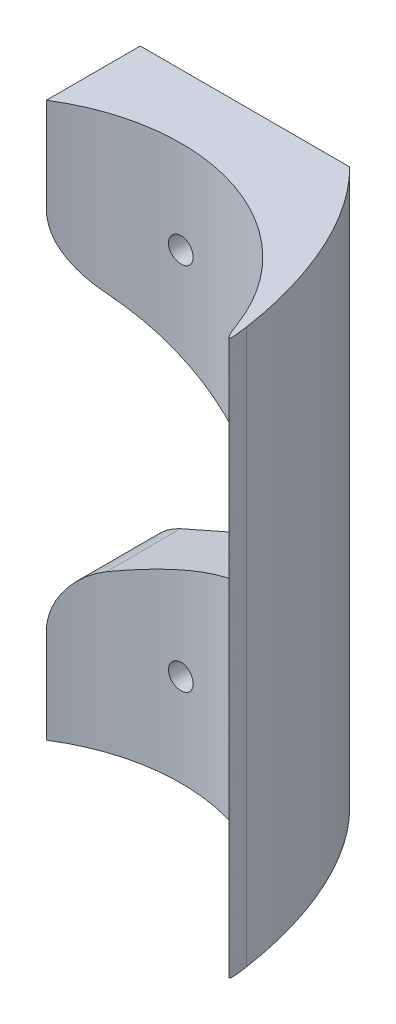
ISO-10303-21;
HEADER;
FILE_DESCRIPTION(('STEP AP214'),'2;1');
FILE_NAME('part.step','',(''),(''),'','','');
FILE_SCHEMA(('AUTOMOTIVE_DESIGN { 1 0 10303 214 1 1 1 1 }'));
ENDSEC;
DATA;
#1=APPLICATION_CONTEXT('core data for automotive mechanical design processes');
#2=APPLICATION_PROTOCOL_DEFINITION('international standard','automotive_design',2000,#1);
#3=PRODUCT_CONTEXT('',#1,'mechanical');
#4=PRODUCT('Part','Part','',(#3));
#5=PRODUCT_RELATED_PRODUCT_CATEGORY('part','',(#4));
#6=PRODUCT_DEFINITION_FORMATION('','',#4);
#7=PRODUCT_DEFINITION_CONTEXT('part definition',#1,'design');
#8=PRODUCT_DEFINITION('design','',#6,#7);
#9=PRODUCT_DEFINITION_SHAPE('','',#8);
#10=(LENGTH_UNIT() NAMED_UNIT(*) SI_UNIT(.MILLI.,.METRE.));
#11=(NAMED_UNIT(*) PLANE_ANGLE_UNIT() SI_UNIT($,.RADIAN.));
#12=(NAMED_UNIT(*) SI_UNIT($,.STERADIAN.) SOLID_ANGLE_UNIT());
#13=UNCERTAINTY_MEASURE_WITH_UNIT(LENGTH_MEASURE(1.E-05),#10,'distance_accuracy_value','');
#14=(GEOMETRIC_REPRESENTATION_CONTEXT(3) GLOBAL_UNCERTAINTY_ASSIGNED_CONTEXT((#13)) GLOBAL_UNIT_ASSIGNED_CONTEXT((#10,
#11,#12)) REPRESENTATION_CONTEXT('',''));
#15=CARTESIAN_POINT('',(0.,0.,0.));
#16=DIRECTION('',(0.,0.,1.));
#17=DIRECTION('',(1.,0.,0.));
#18=AXIS2_PLACEMENT_3D('',#15,#16,#17);
#19=CARTESIAN_POINT('',(0.,45.,-21.1803776745718));
#20=DIRECTION('',(0.,0.,-1.));
#21=DIRECTION('',(-1.,0.,0.));
#22=AXIS2_PLACEMENT_3D('',#19,#20,#21);
#23=PLANE('',#22);
#24=CARTESIAN_POINT('',(0.,7.5,-21.1803776745718));
#25=DIRECTION('',(0.,0.,-1.));
#26=DIRECTION('',(-1.,0.,0.));
#27=AXIS2_PLACEMENT_3D('',#24,#25,#26);
#28=CIRCLE('',#27,1.);
#29=CARTESIAN_POINT('',(-0.999999999999986,7.5,-21.1803776745718));
#30=VERTEX_POINT('',#29);
#31=EDGE_CURVE('E595',#30,#30,#28,.T.);
#32=ORIENTED_EDGE('',*,*,#31,.F.);
#33=EDGE_LOOP('',(#32));
#34=FACE_BOUND('',#33,.T.);
#35=DIRECTION('',(0.,1.,0.));
#36=VECTOR('',#35,1.);
#37=CARTESIAN_POINT('',(-8.5,0.,-21.1803776745718));
#38=LINE('',#37,#36);
#39=CARTESIAN_POINT('',(-8.5,0.,-21.1803776745718));
#40=VERTEX_POINT('',#39);
#41=CARTESIAN_POINT('',(-8.5,7.66500159009755,-21.1803776745718));
#42=VERTEX_POINT('',#41);
#43=EDGE_CURVE('E238',#40,#42,#38,.T.);
#44=ORIENTED_EDGE('',*,*,#43,.T.);
#45=CARTESIAN_POINT('',(-3.,7.66500159009757,-21.1803776745718));
#46=DIRECTION('',(0.,0.,-1.));
#47=DIRECTION('',(-1.,0.,0.));
#48=AXIS2_PLACEMENT_3D('',#45,#46,#47);
#49=CIRCLE('',#48,5.5);
#50=CARTESIAN_POINT('',(-5.22002113616959,12.6970494987487,-21.1803776745718));
#51=VERTEX_POINT('',#50);
#52=EDGE_CURVE('E423',#42,#51,#49,.T.);
#53=ORIENTED_EDGE('',*,*,#52,.T.);
#54=DIRECTION('',(-0.914917801572932,-0.403640206576293,0.));
#55=VECTOR('',#54,1.);
#56=CARTESIAN_POINT('',(-5.5394641564084,12.5561187545257,-21.1803776745718));
#57=LINE('',#56,#55);
#58=CARTESIAN_POINT('',(5.22002113616961,17.3029505012513,-21.1803776745718));
#59=VERTEX_POINT('',#58);
#60=EDGE_CURVE('E420',#59,#51,#57,.T.);
#61=ORIENTED_EDGE('',*,*,#60,.F.);
#62=CARTESIAN_POINT('',(3.,22.3349984099024,-21.1803776745718));
#63=DIRECTION('',(0.,0.,-1.));
#64=DIRECTION('',(-1.,0.,0.));
#65=AXIS2_PLACEMENT_3D('',#62,#63,#64);
#66=CIRCLE('',#65,5.5);
#67=CARTESIAN_POINT('',(8.5,22.3349984099024,-21.1803776745718));
#68=VERTEX_POINT('',#67);
#69=EDGE_CURVE('E415',#68,#59,#66,.T.);
#70=ORIENTED_EDGE('',*,*,#69,.F.);
#71=DIRECTION('',(0.,-1.,0.));
#72=VECTOR('',#71,1.);
#73=CARTESIAN_POINT('',(8.5,45.,-21.1803776745718));
#74=LINE('',#73,#72);
#75=CARTESIAN_POINT('',(8.5,0.,-21.1803776745718));
#76=VERTEX_POINT('',#75);
#77=EDGE_CURVE('E281',#68,#76,#74,.T.);
#78=ORIENTED_EDGE('',*,*,#77,.T.);
#79=DIRECTION('',(1.,0.,0.));
#80=VECTOR('',#79,1.);
#81=CARTESIAN_POINT('',(0.,0.,-21.1803776745718));
#82=LINE('',#81,#80);
#83=EDGE_CURVE('E443',#40,#76,#82,.T.);
#84=ORIENTED_EDGE('',*,*,#83,.F.);
#85=EDGE_LOOP('',(#44,#53,#61,#70,#78,#84));
#86=FACE_BOUND('',#85,.T.);
#87=ADVANCED_FACE('F118',(#34,#86),#23,.T.);
#88=CARTESIAN_POINT('',(0.,45.,0.));
#89=DIRECTION('',(0.,-1.,0.));
#90=DIRECTION('',(0.,0.,-1.));
#91=AXIS2_PLACEMENT_3D('',#88,#89,#90);
#92=CYLINDRICAL_SURFACE('',#91,16.);
#93=CARTESIAN_POINT('',(0.,8.50000000000001,-16.));
#94=CARTESIAN_POINT('',(-0.0561116734183641,8.49999753108858,-15.9999995845718));
#95=CARTESIAN_POINT('',(-0.112262635856497,8.49526135026496,-15.9997016695472));
#96=CARTESIAN_POINT('',(-0.223014105359192,8.47643576614751,-15.9985418686177));
#97=CARTESIAN_POINT('',(-0.277612730612396,8.46233547654854,-15.9976793263185));
#98=CARTESIAN_POINT('',(-0.383639254093894,8.42518824913567,-15.995487847518));
#99=CARTESIAN_POINT('',(-0.435068808330638,8.40214603069408,-15.9941591570758));
#100=CARTESIAN_POINT('',(-0.533316707904362,8.34777667955749,-15.9911848224785));
#101=CARTESIAN_POINT('',(-0.580136105926781,8.31645144425953,-15.989539250935));
#102=CARTESIAN_POINT('',(-0.667918229342458,8.2463538479099,-15.9861133677169));
#103=CARTESIAN_POINT('',(-0.708873140240779,8.20757170863626,-15.9843328810066));
#104=CARTESIAN_POINT('',(-0.783696905169759,8.12368133250729,-15.9808393328824));
#105=CARTESIAN_POINT('',(-0.817565463097668,8.07857283143687,-15.9791262742884));
#106=CARTESIAN_POINT('',(-0.877279186236966,7.98326595884956,-15.9759594183013));
#107=CARTESIAN_POINT('',(-0.903117860756819,7.93306351306164,-15.9745058310452));
#108=CARTESIAN_POINT('',(-0.945996818003619,7.82902237763189,-15.9720241042778));
#109=CARTESIAN_POINT('',(-0.963037195352549,7.77518372710296,-15.9709959601911));
#110=CARTESIAN_POINT('',(-0.987814158715018,7.6654737360691,-15.9694827304962));
#111=CARTESIAN_POINT('',(-0.995562984542572,7.60960516982238,-15.9689969305132));
#112=CARTESIAN_POINT('',(-1.00157466797483,7.49735836087156,-15.9686210332971));
#113=CARTESIAN_POINT('',(-0.999837633013946,7.4409801239471,-15.9687309293172));
#114=CARTESIAN_POINT('',(-0.986937060851403,7.32939774759016,-15.9695333678952));
#115=CARTESIAN_POINT('',(-0.975786769220196,7.27419207006829,-15.9702250917472));
#116=CARTESIAN_POINT('',(-0.944396744262104,7.1664375029772,-15.9721119435897));
#117=CARTESIAN_POINT('',(-0.924156956473636,7.11388862932887,-15.9733070745964));
#118=CARTESIAN_POINT('',(-0.875147436127316,7.01289678972626,-15.976066999066));
#119=CARTESIAN_POINT('',(-0.846371695029927,6.96445674700762,-15.9776320527627));
#120=CARTESIAN_POINT('',(-0.781111460834642,6.87308956471971,-15.9809551904227));
#121=CARTESIAN_POINT('',(-0.744626881072897,6.83016248713669,-15.982713276556));
#122=CARTESIAN_POINT('',(-0.664910031499442,6.75096271176142,-15.9862279896743));
#123=CARTESIAN_POINT('',(-0.62166629833764,6.71470155081568,-15.9879846089879));
#124=CARTESIAN_POINT('',(-0.529698860612781,6.64995191992668,-15.991295531007));
#125=CARTESIAN_POINT('',(-0.480975154135164,6.62146345269901,-15.9928498336419));
#126=CARTESIAN_POINT('',(-0.379423861379106,6.57306886990958,-15.9955810990219));
#127=CARTESIAN_POINT('',(-0.326596066323377,6.55316319129692,-15.996758042555));
#128=CARTESIAN_POINT('',(-0.218339310710251,6.52250694226667,-15.9986017059347));
#129=CARTESIAN_POINT('',(-0.16291038053899,6.51175626492958,-15.9992684317401));
#130=CARTESIAN_POINT('',(-0.0511248774990548,6.49972948638218,-16.0000157621239));
#131=CARTESIAN_POINT('',(0.0052299729584275,6.49843743445324,-16.0000973534494));
#132=CARTESIAN_POINT('',(0.117355606048497,6.50532290663308,-15.9996678453116));
#133=CARTESIAN_POINT('',(0.17312639171902,6.51350038146265,-15.9991567489326));
#134=CARTESIAN_POINT('',(0.282455831103082,6.53907957136343,-15.9976000372996));
#135=CARTESIAN_POINT('',(0.33601620355398,6.55647396826126,-15.9965548461366));
#136=CARTESIAN_POINT('',(0.439457481288695,6.59998580594548,-15.9940475327632));
#137=CARTESIAN_POINT('',(0.489338353473688,6.62610332518877,-15.9925854068029));
#138=CARTESIAN_POINT('',(0.584077738206371,6.68636063083291,-15.9894060556935));
#139=CARTESIAN_POINT('',(0.628929463573064,6.7205110702816,-15.9876884929127));
#140=CARTESIAN_POINT('',(0.712269053211672,6.79584930414364,-15.9841926926019));
#141=CARTESIAN_POINT('',(0.750756854818272,6.83703716784613,-15.9824144544745));
#142=CARTESIAN_POINT('',(0.820330100485819,6.92534989395919,-15.9789948666346));
#143=CARTESIAN_POINT('',(0.851405196389107,6.97248291721468,-15.9773537103402));
#144=CARTESIAN_POINT('',(0.905200136492281,7.07130700937393,-15.9743964406003));
#145=CARTESIAN_POINT('',(0.927920032215697,7.12299805016758,-15.9730803251503));
#146=CARTESIAN_POINT('',(0.96434171908708,7.22943306063597,-15.9709229534197));
#147=CARTESIAN_POINT('',(0.978050023426237,7.28417479428993,-15.9700813542419));
#148=CARTESIAN_POINT('',(0.99608067084691,7.39518833644791,-15.968966972331));
#149=CARTESIAN_POINT('',(1.00040310708366,7.45146012976038,-15.9686941839525));
#150=CARTESIAN_POINT('',(0.999538420240634,7.56383354163889,-15.9687483230443));
#151=CARTESIAN_POINT('',(0.994367566255276,7.61993528661129,-15.9690742245126));
#152=CARTESIAN_POINT('',(0.974696810271312,7.73047230619192,-15.9702868443231));
#153=CARTESIAN_POINT('',(0.960196891369891,7.78490757778057,-15.9711735636814));
#154=CARTESIAN_POINT('',(0.922283263126465,7.8905688969591,-15.973407642964));
#155=CARTESIAN_POINT('',(0.898869617796253,7.94179496759202,-15.9747549995802));
#156=CARTESIAN_POINT('',(0.843795411717921,8.03959109044532,-15.9777584946703));
#157=CARTESIAN_POINT('',(0.81213506458607,8.08616126322528,-15.9794146251456));
#158=CARTESIAN_POINT('',(0.74140605981692,8.17340611618714,-15.9828523464997));
#159=CARTESIAN_POINT('',(0.702325645850194,8.2140712575277,-15.9846341336137));
#160=CARTESIAN_POINT('',(0.617881549043879,8.28827789047345,-15.988120720492));
#161=CARTESIAN_POINT('',(0.572516331232766,8.32181763671958,-15.9898255013133));
#162=CARTESIAN_POINT('',(0.476738724866027,8.38084611029607,-15.9929677448517));
#163=CARTESIAN_POINT('',(0.426320161262646,8.40632482535841,-15.9944048742264));
#164=CARTESIAN_POINT('',(0.321948507757371,8.44842421732072,-15.9968453987164));
#165=CARTESIAN_POINT('',(0.267999641051182,8.46505526848698,-15.9978493015464));
#166=CARTESIAN_POINT('',(0.178100608228009,8.48466472436056,-15.9990471813266));
#167=CARTESIAN_POINT('',(0.14273153971185,8.49040801649777,-15.9994029003706));
#168=CARTESIAN_POINT('',(0.0715803108763633,8.49807643923667,-15.9998794420625));
#169=CARTESIAN_POINT('',(0.0357981511282327,8.50000157511725,-16.0000002650351));
#170=CARTESIAN_POINT('',(0.,8.50000000000001,-16.));
#171=B_SPLINE_CURVE_WITH_KNOTS('',3,(#93,#94,#95,#96,#97,#98,#99,#100,#101,#102,#103,#104,#105,
#106,#107,#108,#109,#110,#111,#112,#113,#114,#115,#116,#117,#118,#119,#120,#121,#122,#123,#124,
#125,#126,#127,#128,#129,#130,#131,#132,#133,#134,#135,#136,#137,#138,#139,#140,#141,#142,#143,
#144,#145,#146,#147,#148,#149,#150,#151,#152,#153,#154,#155,#156,#157,#158,#159,#160,#161,#162,
#163,#164,#165,#166,#167,#168,#169,#170),.UNSPECIFIED.,.T.,.F.,(4,2,2,2,2,2,2,2,2,2,2,2,2,2,2,2,
2,2,2,2,2,2,2,2,2,2,2,2,2,2,2,2,2,2,2,2,2,2,4),(0.,0.168204335736812,0.336604561629083,
0.504916029841642,0.673188976167693,0.841684102124276,1.01018626723216,1.17882428335738,
1.34746048581395,1.5158742979282,1.68428620263516,1.85246152601026,2.02063785705579,
2.18893285109142,2.35722973722373,2.52581521111887,2.69440074391357,2.86299485837158,
3.03158700382427,3.19989477532544,3.36820167096043,3.53637513186954,3.70455010539317,
3.8729493782523,4.04135030923393,4.20998497032328,4.37861859148557,4.54713019711468,
4.71564013024963,4.88386154957344,5.05208327368918,5.2203037897837,5.38851994885565,
5.55700488735896,5.7255310486315,5.8942657148081,6.06280209381717,6.17011332139855,
6.27742440061437),.UNSPECIFIED.);
#172=CARTESIAN_POINT('',(0.,8.50000000000001,-16.));
#173=VERTEX_POINT('',#172);
#174=EDGE_CURVE('E126',#173,#173,#171,.T.);
#175=ORIENTED_EDGE('',*,*,#174,.F.);
#176=EDGE_LOOP('',(#175));
#177=FACE_BOUND('',#176,.T.);
#178=CARTESIAN_POINT('',(0.,38.5,-16.));
#179=CARTESIAN_POINT('',(-0.0561116734183642,38.4999975310886,-15.9999995845718));
#180=CARTESIAN_POINT('',(-0.112262635856497,38.495261350265,-15.9997016695472));
#181=CARTESIAN_POINT('',(-0.223014105359191,38.4764357661475,-15.9985418686177));
#182=CARTESIAN_POINT('',(-0.277612730612395,38.4623354765485,-15.9976793263185));
#183=CARTESIAN_POINT('',(-0.383639254093894,38.4251882491357,-15.995487847518));
#184=CARTESIAN_POINT('',(-0.435068808330639,38.4021460306941,-15.9941591570758));
#185=CARTESIAN_POINT('',(-0.533316707904363,38.3477766795575,-15.9911848224785));
#186=CARTESIAN_POINT('',(-0.580136105926781,38.3164514442595,-15.989539250935));
#187=CARTESIAN_POINT('',(-0.667918229342458,38.2463538479099,-15.9861133677169));
#188=CARTESIAN_POINT('',(-0.708873140240781,38.2075717086363,-15.9843328810066));
#189=CARTESIAN_POINT('',(-0.78369690516976,38.1236813325073,-15.9808393328824));
#190=CARTESIAN_POINT('',(-0.817565463097668,38.0785728314369,-15.9791262742884));
#191=CARTESIAN_POINT('',(-0.877279186236966,37.9832659588496,-15.9759594183013));
#192=CARTESIAN_POINT('',(-0.90311786075682,37.9330635130616,-15.9745058310452));
#193=CARTESIAN_POINT('',(-0.94599681800362,37.8290223776319,-15.9720241042778));
#194=CARTESIAN_POINT('',(-0.96303719535255,37.775183727103,-15.9709959601911));
#195=CARTESIAN_POINT('',(-0.987814158715018,37.6654737360691,-15.9694827304962));
#196=CARTESIAN_POINT('',(-0.995562984542573,37.6096051698224,-15.9689969305132));
#197=CARTESIAN_POINT('',(-1.00157466797483,37.4973583608716,-15.9686210332971));
#198=CARTESIAN_POINT('',(-0.999837633013947,37.4409801239471,-15.9687309293172));
#199=CARTESIAN_POINT('',(-0.986937060851403,37.3293977475902,-15.9695333678952));
#200=CARTESIAN_POINT('',(-0.975786769220196,37.2741920700683,-15.9702250917472));
#201=CARTESIAN_POINT('',(-0.944396744262103,37.1664375029772,-15.9721119435897));
#202=CARTESIAN_POINT('',(-0.924156956473635,37.1138886293289,-15.9733070745964));
#203=CARTESIAN_POINT('',(-0.875147436127315,37.0128967897263,-15.976066999066));
#204=CARTESIAN_POINT('',(-0.846371695029926,36.9644567470076,-15.9776320527627));
#205=CARTESIAN_POINT('',(-0.781111460834643,36.8730895647197,-15.9809551904227));
#206=CARTESIAN_POINT('',(-0.7446268810729,36.8301624871367,-15.982713276556));
#207=CARTESIAN_POINT('',(-0.664910031499445,36.7509627117614,-15.9862279896743));
#208=CARTESIAN_POINT('',(-0.621666298337642,36.7147015508157,-15.9879846089879));
#209=CARTESIAN_POINT('',(-0.529698860612782,36.6499519199267,-15.991295531007));
#210=CARTESIAN_POINT('',(-0.480975154135166,36.621463452699,-15.9928498336419));
#211=CARTESIAN_POINT('',(-0.379423861379108,36.5730688699096,-15.9955810990219));
#212=CARTESIAN_POINT('',(-0.326596066323379,36.5531631912969,-15.996758042555));
#213=CARTESIAN_POINT('',(-0.218339310710253,36.5225069422667,-15.9986017059347));
#214=CARTESIAN_POINT('',(-0.162910380538991,36.5117562649296,-15.9992684317401));
#215=CARTESIAN_POINT('',(-0.0511248774990565,36.4997294863822,-16.0000157621239));
#216=CARTESIAN_POINT('',(0.00522997295842626,36.4984374344532,-16.0000973534494));
#217=CARTESIAN_POINT('',(0.117355606048496,36.5053229066331,-15.9996678453116));
#218=CARTESIAN_POINT('',(0.173126391719019,36.5135003814626,-15.9991567489326));
#219=CARTESIAN_POINT('',(0.282455831103081,36.5390795713634,-15.9976000372996));
#220=CARTESIAN_POINT('',(0.336016203553979,36.5564739682613,-15.9965548461366));
#221=CARTESIAN_POINT('',(0.439457481288695,36.5999858059455,-15.9940475327632));
#222=CARTESIAN_POINT('',(0.489338353473687,36.6261033251888,-15.9925854068029));
#223=CARTESIAN_POINT('',(0.584077738206369,36.6863606308329,-15.9894060556935));
#224=CARTESIAN_POINT('',(0.628929463573062,36.7205110702816,-15.9876884929127));
#225=CARTESIAN_POINT('',(0.71226905321167,36.7958493041436,-15.9841926926019));
#226=CARTESIAN_POINT('',(0.750756854818271,36.8370371678461,-15.9824144544745));
#227=CARTESIAN_POINT('',(0.820330100485819,36.9253498939592,-15.9789948666346));
#228=CARTESIAN_POINT('',(0.851405196389107,36.9724829172147,-15.9773537103402));
#229=CARTESIAN_POINT('',(0.90520013649228,37.0713070093739,-15.9743964406003));
#230=CARTESIAN_POINT('',(0.927920032215696,37.1229980501676,-15.9730803251503));
#231=CARTESIAN_POINT('',(0.964341719087079,37.229433060636,-15.9709229534197));
#232=CARTESIAN_POINT('',(0.978050023426237,37.2841747942899,-15.9700813542419));
#233=CARTESIAN_POINT('',(0.99608067084691,37.3951883364479,-15.968966972331));
#234=CARTESIAN_POINT('',(1.00040310708366,37.4514601297604,-15.9686941839525));
#235=CARTESIAN_POINT('',(0.999538420240634,37.5638335416389,-15.9687483230443));
#236=CARTESIAN_POINT('',(0.994367566255276,37.6199352866113,-15.9690742245126));
#237=CARTESIAN_POINT('',(0.974696810271313,37.7304723061919,-15.9702868443231));
#238=CARTESIAN_POINT('',(0.96019689136989,37.7849075777806,-15.9711735636814));
#239=CARTESIAN_POINT('',(0.922283263126465,37.8905688969591,-15.973407642964));
#240=CARTESIAN_POINT('',(0.898869617796253,37.941794967592,-15.9747549995802));
#241=CARTESIAN_POINT('',(0.843795411717921,38.0395910904453,-15.9777584946703));
#242=CARTESIAN_POINT('',(0.812135064586069,38.0861612632253,-15.9794146251456));
#243=CARTESIAN_POINT('',(0.74140605981692,38.1734061161871,-15.9828523464997));
#244=CARTESIAN_POINT('',(0.702325645850194,38.2140712575277,-15.9846341336137));
#245=CARTESIAN_POINT('',(0.61788154904388,38.2882778904734,-15.988120720492));
#246=CARTESIAN_POINT('',(0.572516331232767,38.3218176367196,-15.9898255013133));
#247=CARTESIAN_POINT('',(0.476738724866027,38.3808461102961,-15.9929677448517));
#248=CARTESIAN_POINT('',(0.426320161262645,38.4063248253584,-15.9944048742264));
#249=CARTESIAN_POINT('',(0.321948507757371,38.4484242173207,-15.9968453987164));
#250=CARTESIAN_POINT('',(0.267999641051184,38.465055268487,-15.9978493015464));
#251=CARTESIAN_POINT('',(0.178100608228012,38.4846647243606,-15.9990471813266));
#252=CARTESIAN_POINT('',(0.142731539711852,38.4904080164978,-15.9994029003706));
#253=CARTESIAN_POINT('',(0.0715803108763643,38.4980764392367,-15.9998794420625));
#254=CARTESIAN_POINT('',(0.0357981511282332,38.5000015751172,-16.0000002650351));
#255=CARTESIAN_POINT('',(0.,38.5,-16.));
#256=B_SPLINE_CURVE_WITH_KNOTS('',3,(#178,#179,#180,#181,#182,#183,#184,#185,#186,#187,#188,
#189,#190,#191,#192,#193,#194,#195,#196,#197,#198,#199,#200,#201,#202,#203,#204,#205,#206,#207,
#208,#209,#210,#211,#212,#213,#214,#215,#216,#217,#218,#219,#220,#221,#222,#223,#224,#225,#226,
#227,#228,#229,#230,#231,#232,#233,#234,#235,#236,#237,#238,#239,#240,#241,#242,#243,#244,#245,
#246,#247,#248,#249,#250,#251,#252,#253,#254,#255),.UNSPECIFIED.,.T.,.F.,(4,2,2,2,2,2,2,2,2,2,2,
2,2,2,2,2,2,2,2,2,2,2,2,2,2,2,2,2,2,2,2,2,2,2,2,2,2,2,4),(0.,0.168204335736812,
0.336604561629082,0.504916029841641,0.673188976167692,0.841684102124275,1.01018626723216,
1.17882428335738,1.34746048581395,1.5158742979282,1.68428620263516,1.85246152601027,
2.0206378570558,2.18893285109142,2.35722973722373,2.52581521111887,2.69440074391357,
2.86299485837158,3.03158700382427,3.19989477532544,3.36820167096044,3.53637513186954,
3.70455010539317,3.8729493782523,4.04135030923393,4.20998497032328,4.37861859148557,
4.54713019711468,4.71564013024963,4.88386154957343,5.05208327368918,5.22030378978371,
5.38851994885565,5.55700488735896,5.7255310486315,5.8942657148081,6.06280209381717,
6.17011332139855,6.27742440061437),.UNSPECIFIED.);
#257=CARTESIAN_POINT('',(0.,38.5,-16.));
#258=VERTEX_POINT('',#257);
#259=EDGE_CURVE('E351',#258,#258,#256,.T.);
#260=ORIENTED_EDGE('',*,*,#259,.F.);
#261=EDGE_LOOP('',(#260));
#262=FACE_BOUND('',#261,.T.);
#263=CARTESIAN_POINT('',(-5.22002113616959,12.6970494987487,-15.1245290616912));
#264=CARTESIAN_POINT('',(-5.36910694497049,12.6312782850701,-15.0730905836253));
#265=CARTESIAN_POINT('',(-5.51485687857656,12.5590605061336,-15.0203042058605));
#266=CARTESIAN_POINT('',(-5.79888520061148,12.4023571663343,-14.9129421968606));
#267=CARTESIAN_POINT('',(-5.9371647044905,12.3178734439511,-14.8583668347145));
#268=CARTESIAN_POINT('',(-6.20581012286426,12.1370330471367,-14.7481892405261));
#269=CARTESIAN_POINT('',(-6.33615684598306,12.0406491646888,-14.69258491198));
#270=CARTESIAN_POINT('',(-6.58787194186116,11.8367410633511,-14.5814561464466));
#271=CARTESIAN_POINT('',(-6.70923993958252,11.7292163795641,-14.5259317128915));
#272=CARTESIAN_POINT('',(-6.9422814849014,11.5035850323189,-14.416009528106));
#273=CARTESIAN_POINT('',(-7.0539545251398,11.3854778157092,-14.3616118359538));
#274=CARTESIAN_POINT('',(-7.26685257373096,11.1392574111782,-14.2550700827728));
#275=CARTESIAN_POINT('',(-7.36807830002816,11.0111449118891,-14.2029258670272));
#276=CARTESIAN_POINT('',(-7.55931794702579,10.7454900648516,-14.1020708876948));
#277=CARTESIAN_POINT('',(-7.64932995854742,10.6079461175258,-14.0533607093774));
#278=CARTESIAN_POINT('',(-7.81721987672641,10.3242382658833,-13.9606685651229));
#279=CARTESIAN_POINT('',(-7.89510546784965,10.1780799021182,-13.9166836103542));
#280=CARTESIAN_POINT('',(-8.03530410517217,9.88341379678162,-13.8361911856955));
#281=CARTESIAN_POINT('',(-8.09808137218141,9.73518598226483,-13.7994695652393));
#282=CARTESIAN_POINT('',(-8.21074702405862,9.43253228849318,-13.7327318786741));
#283=CARTESIAN_POINT('',(-8.26064304897464,9.27811014627404,-13.7027118391981));
#284=CARTESIAN_POINT('',(-8.34670962690598,8.96463562026436,-13.6504568453655));
#285=CARTESIAN_POINT('',(-8.38291534375843,8.80559624434776,-13.6282019575851));
#286=CARTESIAN_POINT('',(-8.44111723219521,8.48408008450959,-13.5922302193868));
#287=CARTESIAN_POINT('',(-8.46312531230491,8.32160629971942,-13.5785062138897));
#288=CARTESIAN_POINT('',(-8.48521644827487,8.07632163978488,-13.5647029988316));
#289=CARTESIAN_POINT('',(-8.49076007439571,7.99414986210215,-13.5612322947979));
#290=CARTESIAN_POINT('',(-8.49815057504827,7.82965767729366,-13.5566015966306));
#291=CARTESIAN_POINT('',(-8.50000113298968,7.74733750030729,-13.5554393001323));
#292=CARTESIAN_POINT('',(-8.5,7.66500159009754,-13.555441711726));
#293=B_SPLINE_CURVE_WITH_KNOTS('',3,(#263,#264,#265,#266,#267,#268,#269,#270,#271,#272,#273,
#274,#275,#276,#277,#278,#279,#280,#281,#282,#283,#284,#285,#286,#287,#288,#289,#290,#291,#292),
.UNSPECIFIED.,.F.,.F.,(4,2,2,2,2,2,2,2,2,2,2,2,2,2,4),(0.,0.512433877279404,1.02479102760729,
1.53834209025661,2.0519145916409,2.56551395325979,3.07907799655018,3.59272935698135,
4.10605388195773,4.60066354948589,5.09497917947936,5.58801638294362,6.08063950296522,
6.32783395486394,6.57478173533281),.UNSPECIFIED.);
#294=CARTESIAN_POINT('',(-5.22002113616959,12.6970494987487,-15.1245290616912));
#295=VERTEX_POINT('',#294);
#296=CARTESIAN_POINT('',(-8.5,7.66500159009755,-13.555441711726));
#297=VERTEX_POINT('',#296);
#298=EDGE_CURVE('E13',#295,#297,#293,.T.);
#299=ORIENTED_EDGE('',*,*,#298,.T.);
#300=DIRECTION('',(0.,-1.,0.));
#301=VECTOR('',#300,1.);
#302=CARTESIAN_POINT('',(-8.5,45.,-13.555441711726));
#303=LINE('',#302,#301);
#304=CARTESIAN_POINT('',(-8.5,0.,-13.555441711726));
#305=VERTEX_POINT('',#304);
#306=EDGE_CURVE('E426',#297,#305,#303,.T.);
#307=ORIENTED_EDGE('',*,*,#306,.T.);
#308=CARTESIAN_POINT('',(0.,0.,0.));
#309=DIRECTION('',(0.,1.,0.));
#310=DIRECTION('',(0.,0.,1.));
#311=AXIS2_PLACEMENT_3D('',#308,#309,#310);
#312=CIRCLE('',#311,16.);
#313=CARTESIAN_POINT('',(14.9969418669284,0.,-5.57599629124426));
#314=VERTEX_POINT('',#313);
#315=EDGE_CURVE('E260',#314,#305,#312,.T.);
#316=ORIENTED_EDGE('',*,*,#315,.F.);
#317=CARTESIAN_POINT('',(14.9969418669284,47.25,-5.57599629124427));
#318=CARTESIAN_POINT('',(14.9969418669284,30.75,-5.57599629124427));
#319=CARTESIAN_POINT('',(14.9969418669284,14.25,-5.57599629124427));
#320=CARTESIAN_POINT('',(14.9969418669284,-2.24999999999999,-5.57599629124427));
#321=(BOUNDED_CURVE() B_SPLINE_CURVE(3,(#317,#318,#319,#320),.UNSPECIFIED.,.F.,
.F.) B_SPLINE_CURVE_WITH_KNOTS((4,4),(-0.02475,0.02475),
.UNSPECIFIED.) CURVE() GEOMETRIC_REPRESENTATION_ITEM() RATIONAL_B_SPLINE_CURVE((1.,1.,1.,1.)) REPRESENTATION_ITEM(''));
#322=CARTESIAN_POINT('',(14.9969418669284,45.,-5.57599629124426));
#323=VERTEX_POINT('',#322);
#324=EDGE_CURVE('E249',#314,#323,#321,.F.);
#325=ORIENTED_EDGE('',*,*,#324,.T.);
#326=CARTESIAN_POINT('',(0.,45.,0.));
#327=DIRECTION('',(0.,1.,0.));
#328=DIRECTION('',(0.,0.,1.));
#329=AXIS2_PLACEMENT_3D('',#326,#327,#328);
#330=CIRCLE('',#329,16.);
#331=CARTESIAN_POINT('',(-8.5,45.,-13.555441711726));
#332=VERTEX_POINT('',#331);
#333=EDGE_CURVE('E255',#323,#332,#330,.T.);
#334=ORIENTED_EDGE('',*,*,#333,.T.);
#335=DIRECTION('',(0.,-1.,0.));
#336=VECTOR('',#335,1.);
#337=CARTESIAN_POINT('',(-8.5,45.,-13.555441711726));
#338=LINE('',#337,#336);
#339=CARTESIAN_POINT('',(-8.5,37.3349984099025,-13.555441711726));
#340=VERTEX_POINT('',#339);
#341=EDGE_CURVE('E234',#332,#340,#338,.T.);
#342=ORIENTED_EDGE('',*,*,#341,.T.);
#343=CARTESIAN_POINT('',(-5.22002113616959,32.3029505012513,-15.1245290616912));
#344=CARTESIAN_POINT('',(-5.36910694497048,32.3687217149299,-15.0730905836253));
#345=CARTESIAN_POINT('',(-5.51485687857656,32.4409394938664,-15.0203042058605));
#346=CARTESIAN_POINT('',(-5.79888520061148,32.5976428336657,-14.9129421968606));
#347=CARTESIAN_POINT('',(-5.93716470449049,32.6821265560489,-14.8583668347145));
#348=CARTESIAN_POINT('',(-6.20581012286425,32.8629669528633,-14.7481892405261));
#349=CARTESIAN_POINT('',(-6.33615684598306,32.9593508353112,-14.69258491198));
#350=CARTESIAN_POINT('',(-6.58787194186116,33.1632589366489,-14.5814561464466));
#351=CARTESIAN_POINT('',(-6.70923993958251,33.2707836204359,-14.5259317128915));
#352=CARTESIAN_POINT('',(-6.9422814849014,33.4964149676811,-14.416009528106));
#353=CARTESIAN_POINT('',(-7.05395452513979,33.6145221842908,-14.3616118359538));
#354=CARTESIAN_POINT('',(-7.26685257373096,33.8607425888218,-14.2550700827728));
#355=CARTESIAN_POINT('',(-7.36807830002816,33.9888550881109,-14.2029258670272));
#356=CARTESIAN_POINT('',(-7.55931794702579,34.2545099351484,-14.1020708876948));
#357=CARTESIAN_POINT('',(-7.64932995854742,34.3920538824742,-14.0533607093774));
#358=CARTESIAN_POINT('',(-7.81721987672641,34.6757617341167,-13.9606685651229));
#359=CARTESIAN_POINT('',(-7.89510546784965,34.8219200978818,-13.9166836103542));
#360=CARTESIAN_POINT('',(-8.03530410517217,35.1165862032184,-13.8361911856955));
#361=CARTESIAN_POINT('',(-8.09808137218141,35.2648140177352,-13.7994695652393));
#362=CARTESIAN_POINT('',(-8.21074702405862,35.5674677115068,-13.7327318786741));
#363=CARTESIAN_POINT('',(-8.26064304897463,35.7218898537259,-13.7027118391981));
#364=CARTESIAN_POINT('',(-8.34670962690598,36.0353643797356,-13.6504568453655));
#365=CARTESIAN_POINT('',(-8.38291534375842,36.1944037556522,-13.628201957585));
#366=CARTESIAN_POINT('',(-8.4411172321952,36.5159199154904,-13.5922302193868));
#367=CARTESIAN_POINT('',(-8.46312531230491,36.6783937002806,-13.5785062138897));
#368=CARTESIAN_POINT('',(-8.48521644827487,36.9236783602151,-13.5647029988316));
#369=CARTESIAN_POINT('',(-8.49076007439571,37.0058501378978,-13.5612322947979));
#370=CARTESIAN_POINT('',(-8.49815057504827,37.1703423227063,-13.5566015966306));
#371=CARTESIAN_POINT('',(-8.50000113298968,37.2526624996927,-13.5554393001323));
#372=CARTESIAN_POINT('',(-8.5,37.3349984099025,-13.555441711726));
#373=B_SPLINE_CURVE_WITH_KNOTS('',3,(#343,#344,#345,#346,#347,#348,#349,#350,#351,#352,#353,
#354,#355,#356,#357,#358,#359,#360,#361,#362,#363,#364,#365,#366,#367,#368,#369,#370,#371,#372),
.UNSPECIFIED.,.F.,.F.,(4,2,2,2,2,2,2,2,2,2,2,2,2,2,4),(0.,0.512433877279405,1.02479102760728,
1.53834209025661,2.0519145916409,2.56551395325979,3.07907799655018,3.59272935698135,
4.10605388195773,4.60066354948589,5.09497917947935,5.58801638294362,6.08063950296521,
6.32783395486393,6.5747817353328),.UNSPECIFIED.);
#374=CARTESIAN_POINT('',(-5.22002113616959,32.3029505012513,-15.1245290616912));
#375=VERTEX_POINT('',#374);
#376=EDGE_CURVE('E339',#375,#340,#373,.T.);
#377=ORIENTED_EDGE('',*,*,#376,.F.);
#378=CARTESIAN_POINT('',(0.,30.,0.));
#379=DIRECTION('',(-0.403640206576294,-0.914917801572932,0.));
#380=DIRECTION('',(0.914917801572932,-0.403640206576294,0.));
#381=AXIS2_PLACEMENT_3D('',#378,#379,#380);
#382=ELLIPSE('',#381,17.4879098127643,16.);
#383=CARTESIAN_POINT('',(5.22002113616962,27.6970494987487,-15.1245290616912));
#384=VERTEX_POINT('',#383);
#385=EDGE_CURVE('E404',#375,#384,#382,.T.);
#386=ORIENTED_EDGE('',*,*,#385,.T.);
#387=CARTESIAN_POINT('',(8.5,22.6650015900976,-13.555441711726));
#388=CARTESIAN_POINT('',(8.5000277974509,22.8060784690147,-13.5554056563039));
#389=CARTESIAN_POINT('',(8.49457330717551,22.9471365524157,-13.5588441081368));
#390=CARTESIAN_POINT('',(8.47291114877699,23.2280203496341,-13.5724011835627));
#391=CARTESIAN_POINT('',(8.45670984357202,23.3678467430958,-13.5825158543174));
#392=CARTESIAN_POINT('',(8.41389660935249,23.6443917909751,-13.6090754640022));
#393=CARTESIAN_POINT('',(8.38734909943028,23.7811242406939,-13.6254812224635));
#394=CARTESIAN_POINT('',(8.32420343279322,24.0514061320946,-13.6641507281718));
#395=CARTESIAN_POINT('',(8.28760422079858,24.1849552379716,-13.686415090475));
#396=CARTESIAN_POINT('',(8.20488863338893,24.4477125966017,-13.7361610011527));
#397=CARTESIAN_POINT('',(8.15879489661209,24.5769303401067,-13.7636301270861));
#398=CARTESIAN_POINT('',(8.05752097414593,24.8306812133463,-13.8231619949258));
#399=CARTESIAN_POINT('',(8.00233726865715,24.9552125053652,-13.8552265156241));
#400=CARTESIAN_POINT('',(7.8237382866284,25.3211654873104,-13.9573611936436));
#401=CARTESIAN_POINT('',(7.68733736325792,25.5547512201871,-14.0333338971466));
#402=CARTESIAN_POINT('',(7.3713124542806,26.0155554759911,-14.2020563640975));
#403=CARTESIAN_POINT('',(7.18902818407707,26.24060887358,-14.2956777469469));
#404=CARTESIAN_POINT('',(6.79293785229803,26.658292393304,-14.4880785365698));
#405=CARTESIAN_POINT('',(6.5791431748263,26.8509341715288,-14.5868560722357));
#406=CARTESIAN_POINT('',(6.17773026495563,27.1594614726104,-14.7604711590378));
#407=CARTESIAN_POINT('',(5.99580618838087,27.2827388317939,-14.8354678640773));
#408=CARTESIAN_POINT('',(5.61798354659418,27.5069347965858,-14.9826455421773));
#409=CARTESIAN_POINT('',(5.42210392103336,27.607882969687,-15.0548301332488));
#410=CARTESIAN_POINT('',(5.22002113616962,27.6970494987487,-15.1245290616912));
#411=B_SPLINE_CURVE_WITH_KNOTS('',3,(#387,#388,#389,#390,#391,#392,#393,#394,#395,#396,#397,
#398,#399,#400,#401,#402,#403,#404,#405,#406,#407,#408,#409,#410),.UNSPECIFIED.,.F.,.F.,(4,2,2,
2,2,2,2,2,2,2,2,4),(0.,0.423053701025584,0.845857145927622,1.26606907776173,1.68632514249751,
2.10559051800743,2.52501862390691,3.364492979599,4.27415303253863,5.18348524475434,
5.87865016936832,6.57288899688752),.UNSPECIFIED.);
#412=CARTESIAN_POINT('',(8.5,22.6650015900976,-13.555441711726));
#413=VERTEX_POINT('',#412);
#414=EDGE_CURVE('E330',#413,#384,#411,.T.);
#415=ORIENTED_EDGE('',*,*,#414,.F.);
#416=DIRECTION('',(0.,-1.,0.));
#417=VECTOR('',#416,1.);
#418=CARTESIAN_POINT('',(8.5,45.,-13.555441711726));
#419=LINE('',#418,#417);
#420=CARTESIAN_POINT('',(8.5,22.3349984099024,-13.555441711726));
#421=VERTEX_POINT('',#420);
#422=EDGE_CURVE('E439',#421,#413,#419,.F.);
#423=ORIENTED_EDGE('',*,*,#422,.F.);
#424=CARTESIAN_POINT('',(5.22002113616961,17.3029505012513,-15.1245290616912));
#425=CARTESIAN_POINT('',(5.36910694497051,17.3687217149299,-15.0730905836253));
#426=CARTESIAN_POINT('',(5.51485687857659,17.4409394938665,-15.0203042058605));
#427=CARTESIAN_POINT('',(5.7988852006115,17.5976428336657,-14.9129421968605));
#428=CARTESIAN_POINT('',(5.93716470449052,17.6821265560489,-14.8583668347145));
#429=CARTESIAN_POINT('',(6.20581012286428,17.8629669528633,-14.7481892405261));
#430=CARTESIAN_POINT('',(6.33615684598309,17.9593508353112,-14.69258491198));
#431=CARTESIAN_POINT('',(6.58787194186118,18.1632589366489,-14.5814561464466));
#432=CARTESIAN_POINT('',(6.70923993958254,18.2707836204359,-14.5259317128914));
#433=CARTESIAN_POINT('',(6.94228148490142,18.4964149676812,-14.4160095281059));
#434=CARTESIAN_POINT('',(7.05395452513982,18.6145221842908,-14.3616118359538));
#435=CARTESIAN_POINT('',(7.26685257373098,18.8607425888218,-14.2550700827728));
#436=CARTESIAN_POINT('',(7.36807830002818,18.9888550881109,-14.2029258670272));
#437=CARTESIAN_POINT('',(7.55931794702581,19.2545099351484,-14.1020708876948));
#438=CARTESIAN_POINT('',(7.64932995854743,19.3920538824742,-14.0533607093774));
#439=CARTESIAN_POINT('',(7.81721987672642,19.6757617341167,-13.9606685651229));
#440=CARTESIAN_POINT('',(7.89510546784966,19.8219200978818,-13.9166836103542));
#441=CARTESIAN_POINT('',(8.03530410517218,20.1165862032184,-13.8361911856955));
#442=CARTESIAN_POINT('',(8.09808137218143,20.2648140177352,-13.7994695652393));
#443=CARTESIAN_POINT('',(8.21074702405863,20.5674677115068,-13.7327318786741));
#444=CARTESIAN_POINT('',(8.26064304897465,20.721889853726,-13.7027118391981));
#445=CARTESIAN_POINT('',(8.34670962690599,21.0353643797357,-13.6504568453655));
#446=CARTESIAN_POINT('',(8.38291534375843,21.1944037556523,-13.628201957585));
#447=CARTESIAN_POINT('',(8.44111723219521,21.5159199154904,-13.5922302193868));
#448=CARTESIAN_POINT('',(8.46312531230492,21.6783937002806,-13.5785062138897));
#449=CARTESIAN_POINT('',(8.48521644827487,21.9236783602151,-13.5647029988316));
#450=CARTESIAN_POINT('',(8.49076007439571,22.0058501378979,-13.5612322947979));
#451=CARTESIAN_POINT('',(8.49815057504827,22.1703423227063,-13.5566015966306));
#452=CARTESIAN_POINT('',(8.50000113298968,22.2526624996927,-13.5554393001323));
#453=CARTESIAN_POINT('',(8.5,22.3349984099024,-13.555441711726));
#454=B_SPLINE_CURVE_WITH_KNOTS('',3,(#424,#425,#426,#427,#428,#429,#430,#431,#432,#433,#434,
#435,#436,#437,#438,#439,#440,#441,#442,#443,#444,#445,#446,#447,#448,#449,#450,#451,#452,#453),
.UNSPECIFIED.,.F.,.F.,(4,2,2,2,2,2,2,2,2,2,2,2,2,2,4),(0.,0.512433877279406,1.02479102760729,
1.53834209025661,2.0519145916409,2.56551395325979,3.07907799655017,3.59272935698135,
4.10605388195773,4.6006635494859,5.09497917947936,5.58801638294362,6.08063950296522,
6.32783395486392,6.57478173533275),.UNSPECIFIED.);
#455=CARTESIAN_POINT('',(5.22002113616961,17.3029505012513,-15.1245290616912));
#456=VERTEX_POINT('',#455);
#457=EDGE_CURVE('E264',#456,#421,#454,.T.);
#458=ORIENTED_EDGE('',*,*,#457,.F.);
#459=CARTESIAN_POINT('',(0.,15.,0.));
#460=DIRECTION('',(0.403640206576293,-0.914917801572932,0.));
#461=DIRECTION('',(-0.914917801572932,-0.403640206576293,0.));
#462=AXIS2_PLACEMENT_3D('',#459,#460,#461);
#463=ELLIPSE('',#462,17.4879098127643,16.);
#464=EDGE_CURVE('E135',#295,#456,#463,.T.);
#465=ORIENTED_EDGE('',*,*,#464,.F.);
#466=EDGE_LOOP('',(#299,#307,#316,#325,#334,#342,#377,#386,#415,#423,#458,#465));
#467=FACE_BOUND('',#466,.T.);
#468=ADVANCED_FACE('F300',(#177,#262,#467),#92,.F.);
#469=CARTESIAN_POINT('',(0.,45.,0.));
#470=DIRECTION('',(0.,1.,0.));
#471=DIRECTION('',(0.,0.,1.));
#472=AXIS2_PLACEMENT_3D('',#469,#470,#471);
#473=PLANE('',#472);
#474=DIRECTION('',(1.,0.,0.));
#475=VECTOR('',#474,1.);
#476=CARTESIAN_POINT('',(0.,45.,-21.1803776745718));
#477=LINE('',#476,#475);
#478=CARTESIAN_POINT('',(-8.5,45.,-21.1803776745718));
#479=VERTEX_POINT('',#478);
#480=CARTESIAN_POINT('',(8.5,45.,-21.1803776745718));
#481=VERTEX_POINT('',#480);
#482=EDGE_CURVE('E245',#479,#481,#477,.T.);
#483=ORIENTED_EDGE('',*,*,#482,.F.);
#484=DIRECTION('',(0.,0.,-1.));
#485=VECTOR('',#484,1.);
#486=CARTESIAN_POINT('',(-8.5,45.,8.81962232542819));
#487=LINE('',#486,#485);
#488=EDGE_CURVE('E227',#332,#479,#487,.T.);
#489=ORIENTED_EDGE('',*,*,#488,.F.);
#490=ORIENTED_EDGE('',*,*,#333,.F.);
#491=CARTESIAN_POINT('',(15.5747907183579,45.,-5.72521280977155));
#492=CARTESIAN_POINT('',(16.0058043455114,45.,-2.86260640488591));
#493=CARTESIAN_POINT('',(14.9969418669284,45.,-5.57599629124427));
#494=(BOUNDED_CURVE() B_SPLINE_CURVE(2,(#491,#492,#493),.UNSPECIFIED.,.F.,
.F.) B_SPLINE_CURVE_WITH_KNOTS((3,3),(0.,1.),
.UNSPECIFIED.) CURVE() GEOMETRIC_REPRESENTATION_ITEM() RATIONAL_B_SPLINE_CURVE((1.,1.,1.)) REPRESENTATION_ITEM(''));
#495=CARTESIAN_POINT('',(15.5747907183579,45.,-5.72521280977155));
#496=VERTEX_POINT('',#495);
#497=EDGE_CURVE('E143',#323,#496,#494,.F.);
#498=ORIENTED_EDGE('',*,*,#497,.T.);
#499=CARTESIAN_POINT('',(0.,45.,0.));
#500=DIRECTION('',(0.,1.,0.));
#501=DIRECTION('',(0.,0.,-1.));
#502=AXIS2_PLACEMENT_3D('',#499,#500,#501);
#503=ELLIPSE('',#502,25.,16.);
#504=EDGE_CURVE('E253',#496,#481,#503,.T.);
#505=ORIENTED_EDGE('',*,*,#504,.T.);
#506=EDGE_LOOP('',(#483,#489,#490,#498,#505));
#507=FACE_BOUND('',#506,.T.);
#508=ADVANCED_FACE('F252',(#507),#473,.T.);
#509=CARTESIAN_POINT('',(0.,0.,0.));
#510=DIRECTION('',(0.,1.,0.));
#511=DIRECTION('',(0.,0.,1.));
#512=AXIS2_PLACEMENT_3D('',#509,#510,#511);
#513=PLANE('',#512);
#514=DIRECTION('',(0.,0.,-1.));
#515=VECTOR('',#514,1.);
#516=CARTESIAN_POINT('',(-8.5,0.,8.81962232542819));
#517=LINE('',#516,#515);
#518=EDGE_CURVE('E424',#305,#40,#517,.T.);
#519=ORIENTED_EDGE('',*,*,#518,.T.);
#520=ORIENTED_EDGE('',*,*,#83,.T.);
#521=CARTESIAN_POINT('',(0.,0.,0.));
#522=DIRECTION('',(0.,1.,0.));
#523=DIRECTION('',(0.,0.,-1.));
#524=AXIS2_PLACEMENT_3D('',#521,#522,#523);
#525=ELLIPSE('',#524,25.,16.);
#526=CARTESIAN_POINT('',(15.5747907183579,0.,-5.72521280977155));
#527=VERTEX_POINT('',#526);
#528=EDGE_CURVE('E256',#527,#76,#525,.T.);
#529=ORIENTED_EDGE('',*,*,#528,.F.);
#530=CARTESIAN_POINT('',(14.9969418669284,-1.87133294970998E-13,-5.57599629124427));
#531=CARTESIAN_POINT('',(16.0058043455114,5.6920614055489E-13,-2.86260640488591));
#532=CARTESIAN_POINT('',(15.5747907183577,-1.72388145425195E-13,-5.72521280977154));
#533=(BOUNDED_CURVE() B_SPLINE_CURVE(2,(#530,#531,#532),.UNSPECIFIED.,.F.,
.F.) B_SPLINE_CURVE_WITH_KNOTS((3,3),(0.,1.),
.UNSPECIFIED.) CURVE() GEOMETRIC_REPRESENTATION_ITEM() RATIONAL_B_SPLINE_CURVE((1.,1.,1.)) REPRESENTATION_ITEM(''));
#534=EDGE_CURVE('E152',#527,#314,#533,.F.);
#535=ORIENTED_EDGE('',*,*,#534,.T.);
#536=ORIENTED_EDGE('',*,*,#315,.T.);
#537=EDGE_LOOP('',(#519,#520,#529,#535,#536));
#538=FACE_BOUND('',#537,.T.);
#539=ADVANCED_FACE('F299',(#538),#513,.F.);
#540=CARTESIAN_POINT('',(0.,37.5,-21.1803776745718));
#541=DIRECTION('',(0.,0.,-1.));
#542=DIRECTION('',(-1.,0.,0.));
#543=AXIS2_PLACEMENT_3D('',#540,#541,#542);
#544=CIRCLE('',#543,1.);
#545=CARTESIAN_POINT('',(-0.999999999999986,37.5,-21.1803776745718));
#546=VERTEX_POINT('',#545);
#547=EDGE_CURVE('E358',#546,#546,#544,.T.);
#548=ORIENTED_EDGE('',*,*,#547,.F.);
#549=EDGE_LOOP('',(#548));
#550=FACE_BOUND('',#549,.T.);
#551=CARTESIAN_POINT('',(3.,22.6650015900976,-21.1803776745718));
#552=DIRECTION('',(0.,0.,-1.));
#553=DIRECTION('',(-1.,0.,0.));
#554=AXIS2_PLACEMENT_3D('',#551,#552,#553);
#555=CIRCLE('',#554,5.5);
#556=CARTESIAN_POINT('',(5.22002113616962,27.6970494987487,-21.1803776745718));
#557=VERTEX_POINT('',#556);
#558=CARTESIAN_POINT('',(8.5,22.6650015900976,-21.1803776745718));
#559=VERTEX_POINT('',#558);
#560=EDGE_CURVE('E410',#557,#559,#555,.T.);
#561=ORIENTED_EDGE('',*,*,#560,.F.);
#562=DIRECTION('',(-0.914917801572932,0.403640206576294,0.));
#563=VECTOR('',#562,1.);
#564=CARTESIAN_POINT('',(11.0789283128168,25.1122375090514,-21.1803776745718));
#565=LINE('',#564,#563);
#566=CARTESIAN_POINT('',(-5.22002113616959,32.3029505012513,-21.1803776745718));
#567=VERTEX_POINT('',#566);
#568=EDGE_CURVE('E360',#557,#567,#565,.T.);
#569=ORIENTED_EDGE('',*,*,#568,.T.);
#570=CARTESIAN_POINT('',(-3.,37.3349984099024,-21.1803776745718));
#571=DIRECTION('',(0.,0.,-1.));
#572=DIRECTION('',(-1.,0.,0.));
#573=AXIS2_PLACEMENT_3D('',#570,#571,#572);
#574=CIRCLE('',#573,5.5);
#575=CARTESIAN_POINT('',(-8.5,37.3349984099025,-21.1803776745718));
#576=VERTEX_POINT('',#575);
#577=EDGE_CURVE('E248',#576,#567,#574,.F.);
#578=ORIENTED_EDGE('',*,*,#577,.F.);
#579=DIRECTION('',(0.,-1.,0.));
#580=VECTOR('',#579,1.);
#581=CARTESIAN_POINT('',(-8.5,45.,-21.1803776745718));
#582=LINE('',#581,#580);
#583=EDGE_CURVE('E231',#479,#576,#582,.T.);
#584=ORIENTED_EDGE('',*,*,#583,.F.);
#585=ORIENTED_EDGE('',*,*,#482,.T.);
#586=EDGE_CURVE('E250',#481,#559,#74,.T.);
#587=ORIENTED_EDGE('',*,*,#586,.T.);
#588=EDGE_LOOP('',(#561,#569,#578,#584,#585,#587));
#589=FACE_BOUND('',#588,.T.);
#590=ADVANCED_FACE('F243',(#550,#589),#23,.T.);
#591=DIRECTION('',(0.,-1.,0.));
#592=VECTOR('',#591,1.);
#593=SURFACE_OF_LINEAR_EXTRUSION('',#503,#592);
#594=ORIENTED_EDGE('',*,*,#504,.F.);
#595=CARTESIAN_POINT('',(15.5747907183579,45.,-5.72521280977155));
#596=DIRECTION('',(0.,-1.,0.));
#597=VECTOR('',#596,1.);
#598=LINE('',#595,#597);
#599=EDGE_CURVE('E484',#496,#527,#598,.T.);
#600=ORIENTED_EDGE('',*,*,#599,.T.);
#601=ORIENTED_EDGE('',*,*,#528,.T.);
#602=ORIENTED_EDGE('',*,*,#77,.F.);
#603=DIRECTION('',(0.,-1.,0.));
#604=VECTOR('',#603,1.);
#605=CARTESIAN_POINT('',(8.5,0.,-21.1803776745718));
#606=LINE('',#605,#604);
#607=EDGE_CURVE('E411',#559,#68,#606,.T.);
#608=ORIENTED_EDGE('',*,*,#607,.F.);
#609=ORIENTED_EDGE('',*,*,#586,.F.);
#610=EDGE_LOOP('',(#594,#600,#601,#602,#608,#609));
#611=FACE_BOUND('',#610,.T.);
#612=ADVANCED_FACE('F276',(#611),#593,.F.);
#613=CARTESIAN_POINT('',(15.5747907183579,47.25,-5.72521280977155));
#614=CARTESIAN_POINT('',(15.5747907183579,30.75,-5.72521280977155));
#615=CARTESIAN_POINT('',(15.5747907183569,14.25,-5.72521280977141));
#616=CARTESIAN_POINT('',(15.5747907183579,-2.24999999999997,-5.72521280977155));
#617=CARTESIAN_POINT('',(16.0058043455114,47.25,-2.86260640488591));
#618=CARTESIAN_POINT('',(16.0058043455114,30.7500000000005,-2.86260640488591));
#619=CARTESIAN_POINT('',(16.0058043455114,14.2500000000002,-2.86260640488591));
#620=CARTESIAN_POINT('',(16.0058043455114,-2.24999999999915,-2.86260640488591));
#621=CARTESIAN_POINT('',(14.9969418669284,47.25,-5.57599629124427));
#622=CARTESIAN_POINT('',(14.9969418669284,30.75,-5.57599629124427));
#623=CARTESIAN_POINT('',(14.9969418669284,14.25,-5.57599629124427));
#624=CARTESIAN_POINT('',(14.9969418669284,-2.24999999999999,-5.57599629124427));
#625=(BOUNDED_SURFACE() B_SPLINE_SURFACE(2,3,((#613,#614,#615,#616),(#617,#618,#619,#620),(#621,
#622,#623,#624)),.UNSPECIFIED.,.F.,.F.,.F.) B_SPLINE_SURFACE_WITH_KNOTS((3,3),(4,4),(0.,1.),
(-0.02475,0.02475),
.UNSPECIFIED.) GEOMETRIC_REPRESENTATION_ITEM() RATIONAL_B_SPLINE_SURFACE(((1.,1.,1.,1.),(1.,1.,
1.,1.),(1.,1.,1.,1.))) REPRESENTATION_ITEM('') SURFACE());
#626=ORIENTED_EDGE('',*,*,#497,.F.);
#627=ORIENTED_EDGE('',*,*,#324,.F.);
#628=ORIENTED_EDGE('',*,*,#534,.F.);
#629=ORIENTED_EDGE('',*,*,#599,.F.);
#630=EDGE_LOOP('',(#626,#627,#628,#629));
#631=FACE_BOUND('',#630,.T.);
#632=ADVANCED_FACE('F121',(#631),#625,.T.);
#633=CARTESIAN_POINT('',(-8.5,0.,8.81962232542819));
#634=DIRECTION('',(-1.,0.,0.));
#635=DIRECTION('',(0.,0.,1.));
#636=AXIS2_PLACEMENT_3D('',#633,#634,#635);
#637=PLANE('',#636);
#638=DIRECTION('',(0.,0.,-1.));
#639=VECTOR('',#638,1.);
#640=CARTESIAN_POINT('',(-8.5,7.66500159009755,8.81962232542819));
#641=LINE('',#640,#639);
#642=EDGE_CURVE('E427',#297,#42,#641,.T.);
#643=ORIENTED_EDGE('',*,*,#642,.T.);
#644=ORIENTED_EDGE('',*,*,#43,.F.);
#645=ORIENTED_EDGE('',*,*,#518,.F.);
#646=ORIENTED_EDGE('',*,*,#306,.F.);
#647=EDGE_LOOP('',(#643,#644,#645,#646));
#648=FACE_BOUND('',#647,.T.);
#649=ADVANCED_FACE('F369',(#648),#637,.T.);
#650=CARTESIAN_POINT('',(-3.,7.66500159009757,8.81962232542819));
#651=DIRECTION('',(0.,0.,-1.));
#652=DIRECTION('',(-1.,0.,0.));
#653=AXIS2_PLACEMENT_3D('',#650,#651,#652);
#654=CYLINDRICAL_SURFACE('',#653,5.5);
#655=DIRECTION('',(0.,0.,-1.));
#656=VECTOR('',#655,1.);
#657=CARTESIAN_POINT('',(-5.22002113616959,12.6970494987487,8.81962232542819));
#658=LINE('',#657,#656);
#659=EDGE_CURVE('E428',#295,#51,#658,.T.);
#660=ORIENTED_EDGE('',*,*,#659,.T.);
#661=ORIENTED_EDGE('',*,*,#52,.F.);
#662=ORIENTED_EDGE('',*,*,#642,.F.);
#663=ORIENTED_EDGE('',*,*,#298,.F.);
#664=EDGE_LOOP('',(#660,#661,#662,#663));
#665=FACE_BOUND('',#664,.T.);
#666=ADVANCED_FACE('F371',(#665),#654,.T.);
#667=CARTESIAN_POINT('',(-5.5394641564084,12.5561187545257,8.81962232542819));
#668=DIRECTION('',(0.403640206576293,-0.914917801572932,0.));
#669=DIRECTION('',(0.914917801572932,0.403640206576293,0.));
#670=AXIS2_PLACEMENT_3D('',#667,#668,#669);
#671=PLANE('',#670);
#672=ORIENTED_EDGE('',*,*,#464,.T.);
#673=DIRECTION('',(0.,0.,-1.));
#674=VECTOR('',#673,1.);
#675=CARTESIAN_POINT('',(5.22002113616961,17.3029505012513,8.81962232542819));
#676=LINE('',#675,#674);
#677=EDGE_CURVE('E430',#456,#59,#676,.T.);
#678=ORIENTED_EDGE('',*,*,#677,.T.);
#679=ORIENTED_EDGE('',*,*,#60,.T.);
#680=ORIENTED_EDGE('',*,*,#659,.F.);
#681=EDGE_LOOP('',(#672,#678,#679,#680));
#682=FACE_BOUND('',#681,.T.);
#683=ADVANCED_FACE('F376',(#682),#671,.F.);
#684=CARTESIAN_POINT('',(3.,22.3349984099024,8.81962232542819));
#685=DIRECTION('',(0.,0.,-1.));
#686=DIRECTION('',(-1.,0.,0.));
#687=AXIS2_PLACEMENT_3D('',#684,#685,#686);
#688=CYLINDRICAL_SURFACE('',#687,5.5);
#689=ORIENTED_EDGE('',*,*,#457,.T.);
#690=DIRECTION('',(0.,0.,-1.));
#691=VECTOR('',#690,1.);
#692=CARTESIAN_POINT('',(8.5,22.3349984099024,8.81962232542819));
#693=LINE('',#692,#691);
#694=EDGE_CURVE('E432',#421,#68,#693,.T.);
#695=ORIENTED_EDGE('',*,*,#694,.T.);
#696=ORIENTED_EDGE('',*,*,#69,.T.);
#697=ORIENTED_EDGE('',*,*,#677,.F.);
#698=EDGE_LOOP('',(#689,#695,#696,#697));
#699=FACE_BOUND('',#698,.T.);
#700=ADVANCED_FACE('F379',(#699),#688,.F.);
#701=CARTESIAN_POINT('',(8.5,0.,8.81962232542819));
#702=DIRECTION('',(1.,0.,0.));
#703=DIRECTION('',(0.,0.,-1.));
#704=AXIS2_PLACEMENT_3D('',#701,#702,#703);
#705=PLANE('',#704);
#706=ORIENTED_EDGE('',*,*,#422,.T.);
#707=DIRECTION('',(0.,0.,-1.));
#708=VECTOR('',#707,1.);
#709=CARTESIAN_POINT('',(8.5,22.6650015900976,8.81962232542819));
#710=LINE('',#709,#708);
#711=EDGE_CURVE('E434',#413,#559,#710,.T.);
#712=ORIENTED_EDGE('',*,*,#711,.T.);
#713=ORIENTED_EDGE('',*,*,#607,.T.);
#714=ORIENTED_EDGE('',*,*,#694,.F.);
#715=EDGE_LOOP('',(#706,#712,#713,#714));
#716=FACE_BOUND('',#715,.T.);
#717=ADVANCED_FACE('F384',(#716),#705,.F.);
#718=CARTESIAN_POINT('',(3.,22.6650015900976,8.81962232542819));
#719=DIRECTION('',(0.,0.,-1.));
#720=DIRECTION('',(-1.,0.,0.));
#721=AXIS2_PLACEMENT_3D('',#718,#719,#720);
#722=CYLINDRICAL_SURFACE('',#721,5.5);
#723=ORIENTED_EDGE('',*,*,#414,.T.);
#724=DIRECTION('',(0.,0.,-1.));
#725=VECTOR('',#724,1.);
#726=CARTESIAN_POINT('',(5.22002113616962,27.6970494987487,8.81962232542819));
#727=LINE('',#726,#725);
#728=EDGE_CURVE('E406',#384,#557,#727,.T.);
#729=ORIENTED_EDGE('',*,*,#728,.T.);
#730=ORIENTED_EDGE('',*,*,#560,.T.);
#731=ORIENTED_EDGE('',*,*,#711,.F.);
#732=EDGE_LOOP('',(#723,#729,#730,#731));
#733=FACE_BOUND('',#732,.T.);
#734=ADVANCED_FACE('F387',(#733),#722,.F.);
#735=CARTESIAN_POINT('',(11.0789283128168,25.1122375090514,8.81962232542819));
#736=DIRECTION('',(-0.403640206576294,-0.914917801572932,0.));
#737=DIRECTION('',(0.914917801572932,-0.403640206576294,0.));
#738=AXIS2_PLACEMENT_3D('',#735,#736,#737);
#739=PLANE('',#738);
#740=DIRECTION('',(0.,0.,-1.));
#741=VECTOR('',#740,1.);
#742=CARTESIAN_POINT('',(-5.22002113616959,32.3029505012513,8.81962232542819));
#743=LINE('',#742,#741);
#744=EDGE_CURVE('E401',#375,#567,#743,.T.);
#745=ORIENTED_EDGE('',*,*,#744,.T.);
#746=ORIENTED_EDGE('',*,*,#568,.F.);
#747=ORIENTED_EDGE('',*,*,#728,.F.);
#748=ORIENTED_EDGE('',*,*,#385,.F.);
#749=EDGE_LOOP('',(#745,#746,#747,#748));
#750=FACE_BOUND('',#749,.T.);
#751=ADVANCED_FACE('F391',(#750),#739,.T.);
#752=CARTESIAN_POINT('',(-3.,37.3349984099024,8.81962232542819));
#753=DIRECTION('',(0.,0.,-1.));
#754=DIRECTION('',(-1.,0.,0.));
#755=AXIS2_PLACEMENT_3D('',#752,#753,#754);
#756=CYLINDRICAL_SURFACE('',#755,5.5);
#757=ORIENTED_EDGE('',*,*,#376,.T.);
#758=DIRECTION('',(0.,0.,-1.));
#759=VECTOR('',#758,1.);
#760=CARTESIAN_POINT('',(-8.5,37.3349984099025,8.81962232542819));
#761=LINE('',#760,#759);
#762=EDGE_CURVE('E237',#340,#576,#761,.T.);
#763=ORIENTED_EDGE('',*,*,#762,.T.);
#764=ORIENTED_EDGE('',*,*,#577,.T.);
#765=ORIENTED_EDGE('',*,*,#744,.F.);
#766=EDGE_LOOP('',(#757,#763,#764,#765));
#767=FACE_BOUND('',#766,.T.);
#768=ADVANCED_FACE('F301',(#767),#756,.T.);
#769=ORIENTED_EDGE('',*,*,#488,.T.);
#770=ORIENTED_EDGE('',*,*,#583,.T.);
#771=ORIENTED_EDGE('',*,*,#762,.F.);
#772=ORIENTED_EDGE('',*,*,#341,.F.);
#773=EDGE_LOOP('',(#769,#770,#771,#772));
#774=FACE_BOUND('',#773,.T.);
#775=ADVANCED_FACE('F229',(#774),#637,.T.);
#776=CARTESIAN_POINT('',(0.,37.5,8.81962232542819));
#777=DIRECTION('',(0.,0.,-1.));
#778=DIRECTION('',(-1.,0.,0.));
#779=AXIS2_PLACEMENT_3D('',#776,#777,#778);
#780=CYLINDRICAL_SURFACE('',#779,1.);
#781=ORIENTED_EDGE('',*,*,#259,.T.);
#782=EDGE_LOOP('',(#781));
#783=FACE_BOUND('',#782,.T.);
#784=ORIENTED_EDGE('',*,*,#547,.T.);
#785=EDGE_LOOP('',(#784));
#786=FACE_BOUND('',#785,.T.);
#787=ADVANCED_FACE('F362',(#783,#786),#780,.F.);
#788=CARTESIAN_POINT('',(0.,7.5,8.81962232542819));
#789=DIRECTION('',(0.,0.,-1.));
#790=DIRECTION('',(-1.,0.,0.));
#791=AXIS2_PLACEMENT_3D('',#788,#789,#790);
#792=CYLINDRICAL_SURFACE('',#791,1.);
#793=ORIENTED_EDGE('',*,*,#174,.T.);
#794=EDGE_LOOP('',(#793));
#795=FACE_BOUND('',#794,.T.);
#796=ORIENTED_EDGE('',*,*,#31,.T.);
#797=EDGE_LOOP('',(#796));
#798=FACE_BOUND('',#797,.T.);
#799=ADVANCED_FACE('F366',(#795,#798),#792,.F.);
#800=CLOSED_SHELL('',(#87,#468,#508,#539,#590,#612,#632,#649,#666,#683,#700,#717,#734,#751,#768,
#775,#787,#799));
#801=MANIFOLD_SOLID_BREP('B2',#800);
#802=ADVANCED_BREP_SHAPE_REPRESENTATION('',(#18,#801),#14);
#803=SHAPE_DEFINITION_REPRESENTATION(#9,#802);
ENDSEC;
END-ISO-10303-21;
